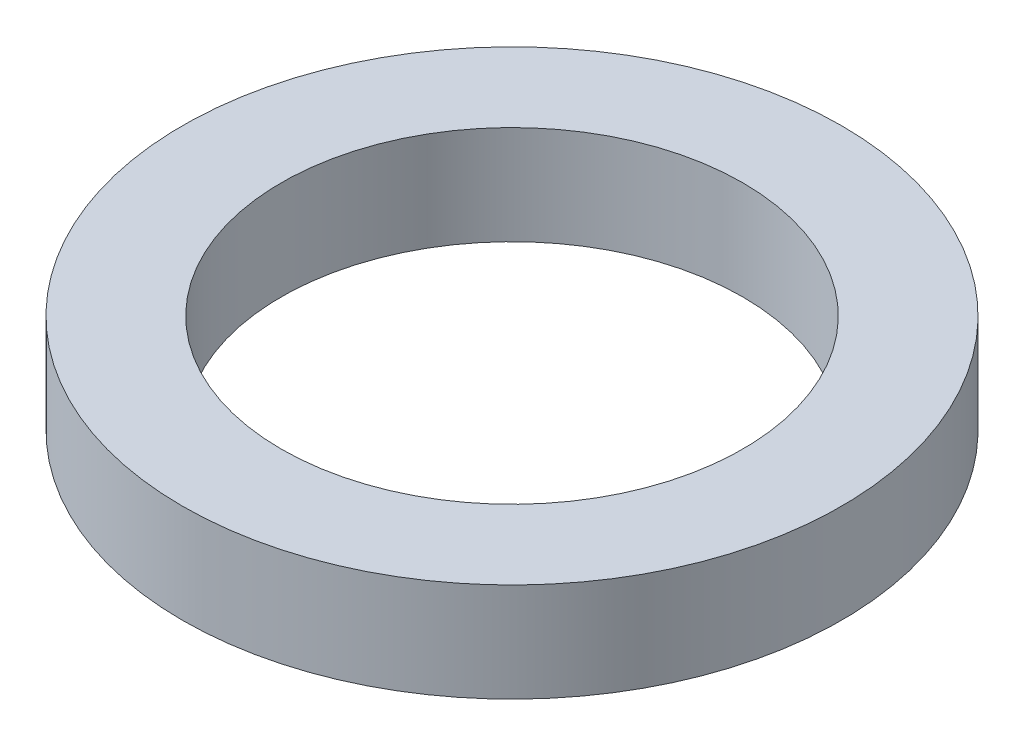
ISO-10303-21;
HEADER;
FILE_DESCRIPTION(('STEP AP214'),'2;1');
FILE_NAME('part.step','',(''),(''),'','','');
FILE_SCHEMA(('AUTOMOTIVE_DESIGN { 1 0 10303 214 1 1 1 1 }'));
ENDSEC;
DATA;
#1=APPLICATION_CONTEXT('core data for automotive mechanical design processes');
#2=APPLICATION_PROTOCOL_DEFINITION('international standard','automotive_design',2000,#1);
#3=PRODUCT_CONTEXT('',#1,'mechanical');
#4=PRODUCT('Part','Part','',(#3));
#5=PRODUCT_RELATED_PRODUCT_CATEGORY('part','',(#4));
#6=PRODUCT_DEFINITION_FORMATION('','',#4);
#7=PRODUCT_DEFINITION_CONTEXT('part definition',#1,'design');
#8=PRODUCT_DEFINITION('design','',#6,#7);
#9=PRODUCT_DEFINITION_SHAPE('','',#8);
#10=(LENGTH_UNIT() NAMED_UNIT(*) SI_UNIT(.MILLI.,.METRE.));
#11=(NAMED_UNIT(*) PLANE_ANGLE_UNIT() SI_UNIT($,.RADIAN.));
#12=(NAMED_UNIT(*) SI_UNIT($,.STERADIAN.) SOLID_ANGLE_UNIT());
#13=UNCERTAINTY_MEASURE_WITH_UNIT(LENGTH_MEASURE(1.E-05),#10,'distance_accuracy_value','');
#14=(GEOMETRIC_REPRESENTATION_CONTEXT(3) GLOBAL_UNCERTAINTY_ASSIGNED_CONTEXT((#13)) GLOBAL_UNIT_ASSIGNED_CONTEXT((#10,
#11,#12)) REPRESENTATION_CONTEXT('',''));
#15=CARTESIAN_POINT('',(0.,0.,0.));
#16=DIRECTION('',(0.,0.,1.));
#17=DIRECTION('',(1.,0.,0.));
#18=AXIS2_PLACEMENT_3D('',#15,#16,#17);
#19=CARTESIAN_POINT('',(0.,1.5,0.));
#20=DIRECTION('',(0.,1.,0.));
#21=DIRECTION('',(0.,0.,1.));
#22=AXIS2_PLACEMENT_3D('',#19,#20,#21);
#23=PLANE('',#22);
#24=CARTESIAN_POINT('',(0.,1.5,0.));
#25=DIRECTION('',(0.,1.,0.));
#26=DIRECTION('',(0.,0.,1.));
#27=AXIS2_PLACEMENT_3D('',#24,#25,#26);
#28=CIRCLE('',#27,5.);
#29=CARTESIAN_POINT('',(0.,1.5,5.));
#30=VERTEX_POINT('',#29);
#31=EDGE_CURVE('E10',#30,#30,#28,.T.);
#32=ORIENTED_EDGE('',*,*,#31,.T.);
#33=EDGE_LOOP('',(#32));
#34=FACE_BOUND('',#33,.T.);
#35=CARTESIAN_POINT('',(0.,1.5,0.));
#36=DIRECTION('',(0.,1.,0.));
#37=DIRECTION('',(0.,0.,1.));
#38=AXIS2_PLACEMENT_3D('',#35,#36,#37);
#39=CIRCLE('',#38,3.5005);
#40=CARTESIAN_POINT('',(0.,1.5,3.5005));
#41=VERTEX_POINT('',#40);
#42=EDGE_CURVE('E50',#41,#41,#39,.T.);
#43=ORIENTED_EDGE('',*,*,#42,.F.);
#44=EDGE_LOOP('',(#43));
#45=FACE_BOUND('',#44,.T.);
#46=ADVANCED_FACE('F37',(#34,#45),#23,.T.);
#47=CARTESIAN_POINT('',(0.,0.,0.));
#48=DIRECTION('',(0.,1.,0.));
#49=DIRECTION('',(0.,0.,1.));
#50=AXIS2_PLACEMENT_3D('',#47,#48,#49);
#51=PLANE('',#50);
#52=CARTESIAN_POINT('',(0.,0.,0.));
#53=DIRECTION('',(0.,1.,0.));
#54=DIRECTION('',(0.,0.,1.));
#55=AXIS2_PLACEMENT_3D('',#52,#53,#54);
#56=CIRCLE('',#55,5.);
#57=CARTESIAN_POINT('',(0.,0.,5.));
#58=VERTEX_POINT('',#57);
#59=EDGE_CURVE('E41',#58,#58,#56,.T.);
#60=ORIENTED_EDGE('',*,*,#59,.F.);
#61=EDGE_LOOP('',(#60));
#62=FACE_BOUND('',#61,.T.);
#63=CARTESIAN_POINT('',(0.,0.,0.));
#64=DIRECTION('',(0.,1.,0.));
#65=DIRECTION('',(0.,0.,1.));
#66=AXIS2_PLACEMENT_3D('',#63,#64,#65);
#67=CIRCLE('',#66,3.5005);
#68=CARTESIAN_POINT('',(0.,0.,3.5005));
#69=VERTEX_POINT('',#68);
#70=EDGE_CURVE('E52',#69,#69,#67,.T.);
#71=ORIENTED_EDGE('',*,*,#70,.T.);
#72=EDGE_LOOP('',(#71));
#73=FACE_BOUND('',#72,.T.);
#74=ADVANCED_FACE('F64',(#62,#73),#51,.F.);
#75=CARTESIAN_POINT('',(0.,1.5,0.));
#76=DIRECTION('',(0.,-1.,0.));
#77=DIRECTION('',(0.,0.,-1.));
#78=AXIS2_PLACEMENT_3D('',#75,#76,#77);
#79=CYLINDRICAL_SURFACE('',#78,5.);
#80=ORIENTED_EDGE('',*,*,#31,.F.);
#81=EDGE_LOOP('',(#80));
#82=FACE_BOUND('',#81,.T.);
#83=ORIENTED_EDGE('',*,*,#59,.T.);
#84=EDGE_LOOP('',(#83));
#85=FACE_BOUND('',#84,.T.);
#86=ADVANCED_FACE('F39',(#82,#85),#79,.T.);
#87=CARTESIAN_POINT('',(0.,1.5,0.));
#88=DIRECTION('',(0.,-1.,0.));
#89=DIRECTION('',(0.,0.,-1.));
#90=AXIS2_PLACEMENT_3D('',#87,#88,#89);
#91=CYLINDRICAL_SURFACE('',#90,3.5005);
#92=ORIENTED_EDGE('',*,*,#42,.T.);
#93=EDGE_LOOP('',(#92));
#94=FACE_BOUND('',#93,.T.);
#95=ORIENTED_EDGE('',*,*,#70,.F.);
#96=EDGE_LOOP('',(#95));
#97=FACE_BOUND('',#96,.T.);
#98=ADVANCED_FACE('F60',(#94,#97),#91,.F.);
#99=CLOSED_SHELL('',(#46,#74,#86,#98));
#100=MANIFOLD_SOLID_BREP('B2',#99);
#101=ADVANCED_BREP_SHAPE_REPRESENTATION('',(#18,#100),#14);
#102=SHAPE_DEFINITION_REPRESENTATION(#9,#101);
ENDSEC;
END-ISO-10303-21;
